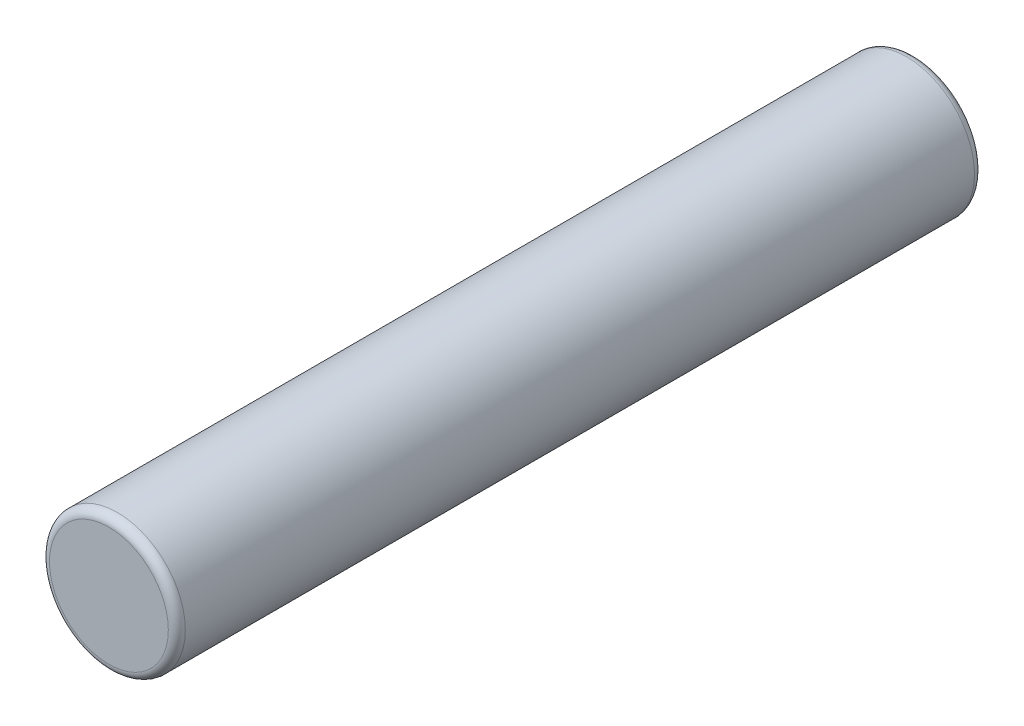
ISO-10303-21;
HEADER;
FILE_DESCRIPTION(('STEP AP214'),'2;1');
FILE_NAME('part.step','',(''),(''),'','','');
FILE_SCHEMA(('AUTOMOTIVE_DESIGN { 1 0 10303 214 1 1 1 1 }'));
ENDSEC;
DATA;
#1=APPLICATION_CONTEXT('core data for automotive mechanical design processes');
#2=APPLICATION_PROTOCOL_DEFINITION('international standard','automotive_design',2000,#1);
#3=PRODUCT_CONTEXT('',#1,'mechanical');
#4=PRODUCT('Part','Part','',(#3));
#5=PRODUCT_RELATED_PRODUCT_CATEGORY('part','',(#4));
#6=PRODUCT_DEFINITION_FORMATION('','',#4);
#7=PRODUCT_DEFINITION_CONTEXT('part definition',#1,'design');
#8=PRODUCT_DEFINITION('design','',#6,#7);
#9=PRODUCT_DEFINITION_SHAPE('','',#8);
#10=(LENGTH_UNIT() NAMED_UNIT(*) SI_UNIT(.MILLI.,.METRE.));
#11=(NAMED_UNIT(*) PLANE_ANGLE_UNIT() SI_UNIT($,.RADIAN.));
#12=(NAMED_UNIT(*) SI_UNIT($,.STERADIAN.) SOLID_ANGLE_UNIT());
#13=UNCERTAINTY_MEASURE_WITH_UNIT(LENGTH_MEASURE(1.E-05),#10,'distance_accuracy_value','');
#14=(GEOMETRIC_REPRESENTATION_CONTEXT(3) GLOBAL_UNCERTAINTY_ASSIGNED_CONTEXT((#13)) GLOBAL_UNIT_ASSIGNED_CONTEXT((#10,
#11,#12)) REPRESENTATION_CONTEXT('',''));
#15=CARTESIAN_POINT('',(0.,0.,0.));
#16=DIRECTION('',(0.,0.,1.));
#17=DIRECTION('',(1.,0.,0.));
#18=AXIS2_PLACEMENT_3D('',#15,#16,#17);
#19=CARTESIAN_POINT('',(0.,0.,241.3));
#20=DIRECTION('',(0.,0.,-1.));
#21=DIRECTION('',(-1.,0.,0.));
#22=AXIS2_PLACEMENT_3D('',#19,#20,#21);
#23=CYLINDRICAL_SURFACE('',#22,20.32);
#24=CARTESIAN_POINT('',(0.,0.,2.53999999999999));
#25=DIRECTION('',(0.,0.,1.));
#26=DIRECTION('',(1.,0.,0.));
#27=AXIS2_PLACEMENT_3D('',#24,#25,#26);
#28=CIRCLE('',#27,20.32);
#29=CARTESIAN_POINT('',(-20.32,0.,2.53999999999999));
#30=VERTEX_POINT('',#29);
#31=EDGE_CURVE('E54',#30,#30,#28,.T.);
#32=CARTESIAN_POINT('',(0.,0.,238.76));
#33=DIRECTION('',(0.,0.,1.));
#34=DIRECTION('',(1.,0.,0.));
#35=AXIS2_PLACEMENT_3D('',#32,#33,#34);
#36=CIRCLE('',#35,20.32);
#37=CARTESIAN_POINT('',(-20.32,0.,238.76));
#38=VERTEX_POINT('',#37);
#39=EDGE_CURVE('E59',#38,#38,#36,.F.);
#40=CARTESIAN_POINT('',(-20.32,0.,2.53999999999999));
#41=CARTESIAN_POINT('',(-20.32,0.,5.00062499999999));
#42=CARTESIAN_POINT('',(-20.32,0.,7.46124999999999));
#43=CARTESIAN_POINT('',(-20.32,0.,12.3825));
#44=CARTESIAN_POINT('',(-20.32,0.,14.843125));
#45=CARTESIAN_POINT('',(-20.32,0.,19.764375));
#46=CARTESIAN_POINT('',(-20.32,0.,22.225));
#47=CARTESIAN_POINT('',(-20.32,0.,27.14625));
#48=CARTESIAN_POINT('',(-20.32,0.,29.606875));
#49=CARTESIAN_POINT('',(-20.32,0.,34.528125));
#50=CARTESIAN_POINT('',(-20.32,0.,36.98875));
#51=CARTESIAN_POINT('',(-20.32,0.,41.91));
#52=CARTESIAN_POINT('',(-20.32,0.,44.370625));
#53=CARTESIAN_POINT('',(-20.32,0.,49.291875));
#54=CARTESIAN_POINT('',(-20.32,0.,51.7525));
#55=CARTESIAN_POINT('',(-20.32,0.,56.67375));
#56=CARTESIAN_POINT('',(-20.32,0.,59.134375));
#57=CARTESIAN_POINT('',(-20.32,0.,64.055625));
#58=CARTESIAN_POINT('',(-20.32,0.,66.51625));
#59=CARTESIAN_POINT('',(-20.32,0.,71.4375));
#60=CARTESIAN_POINT('',(-20.32,0.,73.898125));
#61=CARTESIAN_POINT('',(-20.32,0.,78.819375));
#62=CARTESIAN_POINT('',(-20.32,0.,81.28));
#63=CARTESIAN_POINT('',(-20.32,0.,86.20125));
#64=CARTESIAN_POINT('',(-20.32,0.,88.661875));
#65=CARTESIAN_POINT('',(-20.32,0.,93.583125));
#66=CARTESIAN_POINT('',(-20.32,0.,96.04375));
#67=CARTESIAN_POINT('',(-20.32,0.,100.965));
#68=CARTESIAN_POINT('',(-20.32,0.,103.425625));
#69=CARTESIAN_POINT('',(-20.32,0.,108.346875));
#70=CARTESIAN_POINT('',(-20.32,0.,110.8075));
#71=CARTESIAN_POINT('',(-20.32,0.,115.72875));
#72=CARTESIAN_POINT('',(-20.32,0.,118.189375));
#73=CARTESIAN_POINT('',(-20.32,0.,123.110625));
#74=CARTESIAN_POINT('',(-20.32,0.,125.57125));
#75=CARTESIAN_POINT('',(-20.32,0.,130.4925));
#76=CARTESIAN_POINT('',(-20.32,0.,132.953125));
#77=CARTESIAN_POINT('',(-20.32,0.,137.874375));
#78=CARTESIAN_POINT('',(-20.32,0.,140.335));
#79=CARTESIAN_POINT('',(-20.32,0.,145.25625));
#80=CARTESIAN_POINT('',(-20.32,0.,147.716875));
#81=CARTESIAN_POINT('',(-20.32,0.,152.638125));
#82=CARTESIAN_POINT('',(-20.32,0.,155.09875));
#83=CARTESIAN_POINT('',(-20.32,0.,160.02));
#84=CARTESIAN_POINT('',(-20.32,0.,162.480625));
#85=CARTESIAN_POINT('',(-20.32,0.,167.401875));
#86=CARTESIAN_POINT('',(-20.32,0.,169.8625));
#87=CARTESIAN_POINT('',(-20.32,0.,174.78375));
#88=CARTESIAN_POINT('',(-20.32,0.,177.244375));
#89=CARTESIAN_POINT('',(-20.32,0.,182.165625));
#90=CARTESIAN_POINT('',(-20.32,0.,184.62625));
#91=CARTESIAN_POINT('',(-20.32,0.,189.5475));
#92=CARTESIAN_POINT('',(-20.32,0.,192.008125));
#93=CARTESIAN_POINT('',(-20.32,0.,196.929375));
#94=CARTESIAN_POINT('',(-20.32,0.,199.39));
#95=CARTESIAN_POINT('',(-20.32,0.,204.31125));
#96=CARTESIAN_POINT('',(-20.32,0.,206.771875));
#97=CARTESIAN_POINT('',(-20.32,0.,211.693125));
#98=CARTESIAN_POINT('',(-20.32,0.,214.15375));
#99=CARTESIAN_POINT('',(-20.32,0.,219.075));
#100=CARTESIAN_POINT('',(-20.32,0.,221.535625));
#101=CARTESIAN_POINT('',(-20.32,0.,226.456875));
#102=CARTESIAN_POINT('',(-20.32,0.,228.9175));
#103=CARTESIAN_POINT('',(-20.32,0.,233.83875));
#104=CARTESIAN_POINT('',(-20.32,0.,236.299375));
#105=CARTESIAN_POINT('',(-20.32,0.,238.76));
#106=B_SPLINE_CURVE_WITH_KNOTS('',3,(#40,#41,#42,#43,#44,#45,#46,#47,#48,#49,#50,#51,#52,#53,
#54,#55,#56,#57,#58,#59,#60,#61,#62,#63,#64,#65,#66,#67,#68,#69,#70,#71,#72,#73,#74,#75,#76,#77,
#78,#79,#80,#81,#82,#83,#84,#85,#86,#87,#88,#89,#90,#91,#92,#93,#94,#95,#96,#97,#98,#99,#100,
#101,#102,#103,#104,#105),.UNSPECIFIED.,.F.,.F.,(4,2,2,2,2,2,2,2,2,2,2,2,2,2,2,2,2,2,2,2,2,2,2,
2,2,2,2,2,2,2,2,2,4),(0.,7.38187500000001,14.76375,22.145625,29.5275,36.909375,44.29125,
51.673125,59.055,66.436875,73.81875,81.200625,88.5825,95.964375,103.34625,110.728125,118.11,
125.491875,132.87375,140.255625,147.6375,155.019375,162.40125,169.783125,177.165,184.546875,
191.92875,199.310625,206.6925,214.074375,221.45625,228.838125,236.22),.UNSPECIFIED.);
#107=EDGE_CURVE('BSEAM41',#30,#38,#106,.T.);
#108=ORIENTED_EDGE('',*,*,#31,.T.);
#109=ORIENTED_EDGE('',*,*,#39,.T.);
#110=ORIENTED_EDGE('',*,*,#107,.T.);
#111=ORIENTED_EDGE('',*,*,#107,.F.);
#112=EDGE_LOOP('',(#108,#110,#109,#111));
#113=FACE_BOUND('',#112,.T.);
#114=ADVANCED_FACE('F41',(#113),#23,.T.);
#115=CARTESIAN_POINT('',(0.,0.,241.3));
#116=DIRECTION('',(0.,0.,1.));
#117=DIRECTION('',(1.,0.,0.));
#118=AXIS2_PLACEMENT_3D('',#115,#116,#117);
#119=PLANE('',#118);
#120=CARTESIAN_POINT('',(0.,0.,241.3));
#121=DIRECTION('',(0.,0.,1.));
#122=DIRECTION('',(1.,0.,0.));
#123=AXIS2_PLACEMENT_3D('',#120,#121,#122);
#124=CIRCLE('',#123,17.78);
#125=CARTESIAN_POINT('',(17.78,0.,241.3));
#126=VERTEX_POINT('',#125);
#127=EDGE_CURVE('E10',#126,#126,#124,.T.);
#128=ORIENTED_EDGE('',*,*,#127,.T.);
#129=EDGE_LOOP('',(#128));
#130=FACE_BOUND('',#129,.T.);
#131=ADVANCED_FACE('F76',(#130),#119,.T.);
#132=CARTESIAN_POINT('',(0.,0.,0.));
#133=DIRECTION('',(0.,0.,1.));
#134=DIRECTION('',(1.,0.,0.));
#135=AXIS2_PLACEMENT_3D('',#132,#133,#134);
#136=PLANE('',#135);
#137=CARTESIAN_POINT('',(0.,0.,0.));
#138=DIRECTION('',(0.,0.,1.));
#139=DIRECTION('',(1.,0.,0.));
#140=AXIS2_PLACEMENT_3D('',#137,#138,#139);
#141=CIRCLE('',#140,17.78);
#142=CARTESIAN_POINT('',(17.78,0.,0.));
#143=VERTEX_POINT('',#142);
#144=EDGE_CURVE('E49',#143,#143,#141,.F.);
#145=ORIENTED_EDGE('',*,*,#144,.T.);
#146=EDGE_LOOP('',(#145));
#147=FACE_BOUND('',#146,.T.);
#148=ADVANCED_FACE('F73',(#147),#136,.F.);
#149=CARTESIAN_POINT('',(0.,0.,2.53999999999999));
#150=DIRECTION('',(0.,0.,1.));
#151=DIRECTION('',(1.,0.,0.));
#152=AXIS2_PLACEMENT_3D('',#149,#150,#151);
#153=TOROIDAL_SURFACE('',#152,17.78,2.54);
#154=ORIENTED_EDGE('',*,*,#144,.F.);
#155=EDGE_LOOP('',(#154));
#156=FACE_BOUND('',#155,.T.);
#157=ORIENTED_EDGE('',*,*,#31,.F.);
#158=EDGE_LOOP('',(#157));
#159=FACE_BOUND('',#158,.T.);
#160=ADVANCED_FACE('F69',(#156,#159),#153,.T.);
#161=CARTESIAN_POINT('',(0.,0.,238.76));
#162=DIRECTION('',(0.,0.,1.));
#163=DIRECTION('',(1.,0.,0.));
#164=AXIS2_PLACEMENT_3D('',#161,#162,#163);
#165=TOROIDAL_SURFACE('',#164,17.78,2.54);
#166=ORIENTED_EDGE('',*,*,#39,.F.);
#167=EDGE_LOOP('',(#166));
#168=FACE_BOUND('',#167,.T.);
#169=ORIENTED_EDGE('',*,*,#127,.F.);
#170=EDGE_LOOP('',(#169));
#171=FACE_BOUND('',#170,.T.);
#172=ADVANCED_FACE('F43',(#168,#171),#165,.T.);
#173=CLOSED_SHELL('',(#114,#131,#148,#160,#172));
#174=MANIFOLD_SOLID_BREP('B2',#173);
#175=ADVANCED_BREP_SHAPE_REPRESENTATION('',(#18,#174),#14);
#176=SHAPE_DEFINITION_REPRESENTATION(#9,#175);
ENDSEC;
END-ISO-10303-21;
